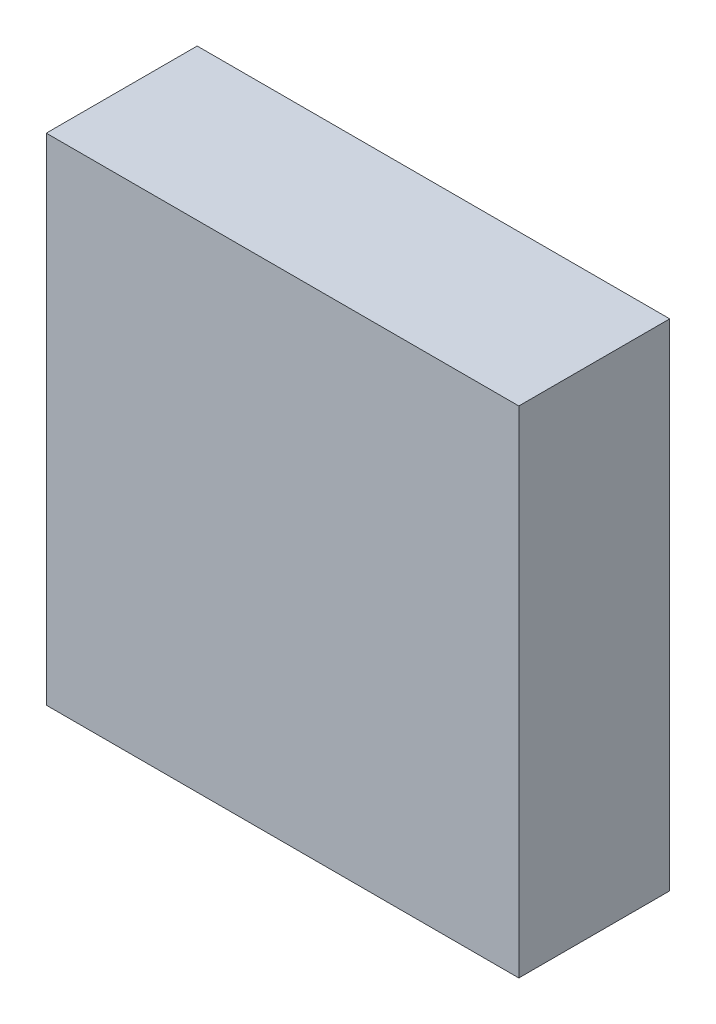
ISO-10303-21;
HEADER;
FILE_DESCRIPTION(('STEP AP214'),'2;1');
FILE_NAME('part.step','',(''),(''),'','','');
FILE_SCHEMA(('AUTOMOTIVE_DESIGN { 1 0 10303 214 1 1 1 1 }'));
ENDSEC;
DATA;
#1=APPLICATION_CONTEXT('core data for automotive mechanical design processes');
#2=APPLICATION_PROTOCOL_DEFINITION('international standard','automotive_design',2000,#1);
#3=PRODUCT_CONTEXT('',#1,'mechanical');
#4=PRODUCT('Part','Part','',(#3));
#5=PRODUCT_RELATED_PRODUCT_CATEGORY('part','',(#4));
#6=PRODUCT_DEFINITION_FORMATION('','',#4);
#7=PRODUCT_DEFINITION_CONTEXT('part definition',#1,'design');
#8=PRODUCT_DEFINITION('design','',#6,#7);
#9=PRODUCT_DEFINITION_SHAPE('','',#8);
#10=(LENGTH_UNIT() NAMED_UNIT(*) SI_UNIT(.MILLI.,.METRE.));
#11=(NAMED_UNIT(*) PLANE_ANGLE_UNIT() SI_UNIT($,.RADIAN.));
#12=(NAMED_UNIT(*) SI_UNIT($,.STERADIAN.) SOLID_ANGLE_UNIT());
#13=UNCERTAINTY_MEASURE_WITH_UNIT(LENGTH_MEASURE(1.E-05),#10,'distance_accuracy_value','');
#14=(GEOMETRIC_REPRESENTATION_CONTEXT(3) GLOBAL_UNCERTAINTY_ASSIGNED_CONTEXT((#13)) GLOBAL_UNIT_ASSIGNED_CONTEXT((#10,
#11,#12)) REPRESENTATION_CONTEXT('',''));
#15=CARTESIAN_POINT('',(0.,0.,0.));
#16=DIRECTION('',(0.,0.,1.));
#17=DIRECTION('',(1.,0.,0.));
#18=AXIS2_PLACEMENT_3D('',#15,#16,#17);
#19=CARTESIAN_POINT('',(11.958147865414,45.964471977933,-2.519325613316));
#20=DIRECTION('',(0.,8.74227339409097E-08,-1.));
#21=DIRECTION('',(-1.,0.,0.));
#22=AXIS2_PLACEMENT_3D('',#19,#20,#21);
#23=PLANE('',#22);
#24=CARTESIAN_POINT('',(11.958147865414,45.964471977933,-2.519325613316));
#25=DIRECTION('',(0.,8.74227339409097E-08,-1.));
#26=DIRECTION('',(1.19248806384999E-08,1.,8.74227339409097E-08));
#27=AXIS2_PLACEMENT_3D('',#24,#25,#26);
#28=CIRCLE('',#27,0.203125);
#29=CARTESIAN_POINT('',(11.958147867837,46.167596977933,-2.519325595558));
#30=VERTEX_POINT('',#29);
#31=EDGE_CURVE('E27',#30,#30,#28,.T.);
#32=ORIENTED_EDGE('',*,*,#31,.T.);
#33=EDGE_LOOP('',(#32));
#34=FACE_BOUND('',#33,.T.);
#35=ADVANCED_FACE('F16',(#34),#23,.T.);
#36=CARTESIAN_POINT('',(11.958147865414,45.964471977933,-2.519325613316));
#37=DIRECTION('',(0.,8.74227339409097E-08,-1.));
#38=DIRECTION('',(1.19248806384999E-08,1.,8.74227339409097E-08));
#39=AXIS2_PLACEMENT_3D('',#36,#37,#38);
#40=CYLINDRICAL_SURFACE('',#39,0.203125);
#41=ORIENTED_EDGE('',*,*,#31,.F.);
#42=DIRECTION('',(0.,8.74227339409097E-08,-1.));
#43=VECTOR('',#42,1.);
#44=CARTESIAN_POINT('',(11.958147867837,46.167596977933,-2.519325595558));
#45=LINE('',#44,#43);
#46=CARTESIAN_POINT('',(11.958147867837,46.167596986675,-2.619325595558));
#47=VERTEX_POINT('',#46);
#48=EDGE_CURVE('E11',#30,#47,#45,.T.);
#49=ORIENTED_EDGE('',*,*,#48,.T.);
#50=CARTESIAN_POINT('',(11.958147865414,45.964471986675,-2.619325613316));
#51=DIRECTION('',(0.,8.74227339409097E-08,-1.));
#52=DIRECTION('',(1.19248806384999E-08,1.,8.74227339409097E-08));
#53=AXIS2_PLACEMENT_3D('',#50,#51,#52);
#54=CIRCLE('',#53,0.203125);
#55=EDGE_CURVE('E93',#47,#47,#54,.T.);
#56=ORIENTED_EDGE('',*,*,#55,.T.);
#57=ORIENTED_EDGE('',*,*,#48,.F.);
#58=EDGE_LOOP('',(#41,#49,#56,#57));
#59=FACE_BOUND('',#58,.T.);
#60=ADVANCED_FACE('F182',(#59),#40,.F.);
#61=CARTESIAN_POINT('',(9.399814564378,48.672805263967,-1.629325376546));
#62=DIRECTION('',(1.19248806384999E-08,1.,8.74227339409097E-08));
#63=DIRECTION('',(0.990824706895941,0.,-0.135153247110723));
#64=AXIS2_PLACEMENT_3D('',#61,#62,#63);
#65=PLANE('',#64);
#66=DIRECTION('',(0.,8.74227339409097E-08,-1.));
#67=VECTOR('',#66,1.);
#68=CARTESIAN_POINT('',(9.399814564378,48.672805263967,-1.629325376546));
#69=LINE('',#68,#67);
#70=CARTESIAN_POINT('',(9.399814564378,48.672805263967,-1.629325376546));
#71=VERTEX_POINT('',#70);
#72=CARTESIAN_POINT('',(9.399814564378,48.672805350516,-2.619325376546));
#73=VERTEX_POINT('',#72);
#74=EDGE_CURVE('E117',#71,#73,#69,.T.);
#75=ORIENTED_EDGE('',*,*,#74,.F.);
#76=DIRECTION('',(1.,-1.19248806385E-08,0.));
#77=VECTOR('',#76,1.);
#78=CARTESIAN_POINT('',(9.399814564378,48.672805263967,-1.629325376546));
#79=LINE('',#78,#77);
#80=CARTESIAN_POINT('',(12.499814564378,48.672805227,-1.629325376546));
#81=VERTEX_POINT('',#80);
#82=EDGE_CURVE('E73',#71,#81,#79,.T.);
#83=ORIENTED_EDGE('',*,*,#82,.T.);
#84=DIRECTION('',(0.,8.74227339409097E-08,-1.));
#85=VECTOR('',#84,1.);
#86=CARTESIAN_POINT('',(12.499814564378,48.672805227,-1.629325376546));
#87=LINE('',#86,#85);
#88=CARTESIAN_POINT('',(12.499814564378,48.672805313549,-2.619325376546));
#89=VERTEX_POINT('',#88);
#90=EDGE_CURVE('E124',#81,#89,#87,.T.);
#91=ORIENTED_EDGE('',*,*,#90,.T.);
#92=DIRECTION('',(1.,-1.19248806385E-08,0.));
#93=VECTOR('',#92,1.);
#94=CARTESIAN_POINT('',(9.399814564378,48.672805350516,-2.619325376546));
#95=LINE('',#94,#93);
#96=EDGE_CURVE('E61',#73,#89,#95,.T.);
#97=ORIENTED_EDGE('',*,*,#96,.F.);
#98=EDGE_LOOP('',(#75,#83,#91,#97));
#99=FACE_BOUND('',#98,.T.);
#100=ADVANCED_FACE('F137',(#99),#65,.T.);
#101=CARTESIAN_POINT('',(9.399814525622,45.422805263967,-1.62932566067));
#102=DIRECTION('',(0.,8.74227339409097E-08,-1.));
#103=DIRECTION('',(-1.,0.,0.));
#104=AXIS2_PLACEMENT_3D('',#101,#102,#103);
#105=PLANE('',#104);
#106=DIRECTION('',(1.19248806384999E-08,1.,8.74227339409097E-08));
#107=VECTOR('',#106,1.);
#108=CARTESIAN_POINT('',(12.499814525622,45.422805227,-1.62932566067));
#109=LINE('',#108,#107);
#110=CARTESIAN_POINT('',(12.499814525622,45.422805227,-1.62932566067));
#111=VERTEX_POINT('',#110);
#112=EDGE_CURVE('E98',#111,#81,#109,.T.);
#113=ORIENTED_EDGE('',*,*,#112,.T.);
#114=ORIENTED_EDGE('',*,*,#82,.F.);
#115=DIRECTION('',(1.19248806384999E-08,1.,8.74227339409097E-08));
#116=VECTOR('',#115,1.);
#117=CARTESIAN_POINT('',(9.399814525622,45.422805263967,-1.62932566067));
#118=LINE('',#117,#116);
#119=CARTESIAN_POINT('',(9.399814525622,45.422805263967,-1.62932566067));
#120=VERTEX_POINT('',#119);
#121=EDGE_CURVE('E128',#120,#71,#118,.T.);
#122=ORIENTED_EDGE('',*,*,#121,.F.);
#123=DIRECTION('',(1.,-1.19248806385E-08,0.));
#124=VECTOR('',#123,1.);
#125=CARTESIAN_POINT('',(9.399814525622,45.422805263967,-1.62932566067));
#126=LINE('',#125,#124);
#127=EDGE_CURVE('E103',#120,#111,#126,.T.);
#128=ORIENTED_EDGE('',*,*,#127,.T.);
#129=EDGE_LOOP('',(#113,#114,#122,#128));
#130=FACE_BOUND('',#129,.T.);
#131=ADVANCED_FACE('F138',(#130),#105,.F.);
#132=CARTESIAN_POINT('',(12.499814525622,45.422805227,-1.62932566067));
#133=DIRECTION('',(1.,-1.19248806385E-08,0.));
#134=DIRECTION('',(0.,8.74227371082626E-08,-1.));
#135=AXIS2_PLACEMENT_3D('',#132,#133,#134);
#136=PLANE('',#135);
#137=ORIENTED_EDGE('',*,*,#112,.F.);
#138=DIRECTION('',(0.,8.74227339409097E-08,-1.));
#139=VECTOR('',#138,1.);
#140=CARTESIAN_POINT('',(12.499814525622,45.422805227,-1.62932566067));
#141=LINE('',#140,#139);
#142=CARTESIAN_POINT('',(12.499814525622,45.422805313549,-2.61932566067));
#143=VERTEX_POINT('',#142);
#144=EDGE_CURVE('E96',#111,#143,#141,.T.);
#145=ORIENTED_EDGE('',*,*,#144,.T.);
#146=DIRECTION('',(1.19248806384999E-08,1.,8.74227339409097E-08));
#147=VECTOR('',#146,1.);
#148=CARTESIAN_POINT('',(12.499814525622,45.422805313549,-2.61932566067));
#149=LINE('',#148,#147);
#150=EDGE_CURVE('E85',#143,#89,#149,.T.);
#151=ORIENTED_EDGE('',*,*,#150,.T.);
#152=ORIENTED_EDGE('',*,*,#90,.F.);
#153=EDGE_LOOP('',(#137,#145,#151,#152));
#154=FACE_BOUND('',#153,.T.);
#155=ADVANCED_FACE('F97',(#154),#136,.T.);
#156=CARTESIAN_POINT('',(9.399814525622,45.422805350516,-2.61932566067));
#157=DIRECTION('',(0.,8.74227339409097E-08,-1.));
#158=DIRECTION('',(-1.,0.,0.));
#159=AXIS2_PLACEMENT_3D('',#156,#157,#158);
#160=PLANE('',#159);
#161=ORIENTED_EDGE('',*,*,#55,.F.);
#162=EDGE_LOOP('',(#161));
#163=FACE_BOUND('',#162,.T.);
#164=DIRECTION('',(1.,-1.19248806385E-08,0.));
#165=VECTOR('',#164,1.);
#166=CARTESIAN_POINT('',(9.399814525622,45.422805350516,-2.61932566067));
#167=LINE('',#166,#165);
#168=CARTESIAN_POINT('',(9.399814525622,45.422805350516,-2.61932566067));
#169=VERTEX_POINT('',#168);
#170=EDGE_CURVE('E89',#169,#143,#167,.T.);
#171=ORIENTED_EDGE('',*,*,#170,.F.);
#172=DIRECTION('',(1.19248806384999E-08,1.,8.74227339409097E-08));
#173=VECTOR('',#172,1.);
#174=CARTESIAN_POINT('',(9.399814525622,45.422805350516,-2.61932566067));
#175=LINE('',#174,#173);
#176=EDGE_CURVE('E20',#169,#73,#175,.T.);
#177=ORIENTED_EDGE('',*,*,#176,.T.);
#178=ORIENTED_EDGE('',*,*,#96,.T.);
#179=ORIENTED_EDGE('',*,*,#150,.F.);
#180=EDGE_LOOP('',(#171,#177,#178,#179));
#181=FACE_BOUND('',#180,.T.);
#182=ADVANCED_FACE('F87',(#163,#181),#160,.T.);
#183=CARTESIAN_POINT('',(9.399814525622,45.422805263967,-1.62932566067));
#184=DIRECTION('',(1.,-1.19248806385E-08,0.));
#185=DIRECTION('',(0.,8.74227371082626E-08,-1.));
#186=AXIS2_PLACEMENT_3D('',#183,#184,#185);
#187=PLANE('',#186);
#188=ORIENTED_EDGE('',*,*,#74,.T.);
#189=ORIENTED_EDGE('',*,*,#176,.F.);
#190=DIRECTION('',(0.,8.74227339409097E-08,-1.));
#191=VECTOR('',#190,1.);
#192=CARTESIAN_POINT('',(9.399814525622,45.422805263967,-1.62932566067));
#193=LINE('',#192,#191);
#194=EDGE_CURVE('E108',#120,#169,#193,.T.);
#195=ORIENTED_EDGE('',*,*,#194,.F.);
#196=ORIENTED_EDGE('',*,*,#121,.T.);
#197=EDGE_LOOP('',(#188,#189,#195,#196));
#198=FACE_BOUND('',#197,.T.);
#199=ADVANCED_FACE('F18',(#198),#187,.F.);
#200=CARTESIAN_POINT('',(9.399814525622,45.422805263967,-1.62932566067));
#201=DIRECTION('',(1.19248806384999E-08,1.,8.74227339409097E-08));
#202=DIRECTION('',(0.990824706895941,0.,-0.135153247110723));
#203=AXIS2_PLACEMENT_3D('',#200,#201,#202);
#204=PLANE('',#203);
#205=ORIENTED_EDGE('',*,*,#170,.T.);
#206=ORIENTED_EDGE('',*,*,#144,.F.);
#207=ORIENTED_EDGE('',*,*,#127,.F.);
#208=ORIENTED_EDGE('',*,*,#194,.T.);
#209=EDGE_LOOP('',(#205,#206,#207,#208));
#210=FACE_BOUND('',#209,.T.);
#211=ADVANCED_FACE('F106',(#210),#204,.F.);
#212=CLOSED_SHELL('',(#35,#60,#100,#131,#155,#182,#199,#211));
#213=MANIFOLD_SOLID_BREP('B1',#212);
#214=ADVANCED_BREP_SHAPE_REPRESENTATION('',(#18,#213),#14);
#215=SHAPE_DEFINITION_REPRESENTATION(#9,#214);
ENDSEC;
END-ISO-10303-21;
